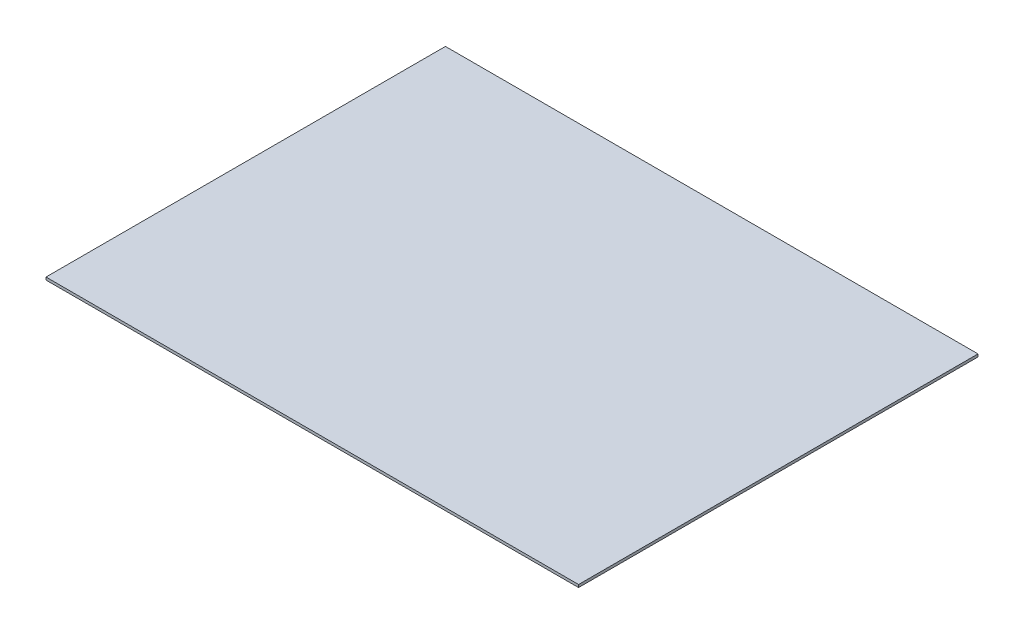
ISO-10303-21;
HEADER;
FILE_DESCRIPTION(('STEP AP214'),'2;1');
FILE_NAME('part.step','',(''),(''),'','','');
FILE_SCHEMA(('AUTOMOTIVE_DESIGN { 1 0 10303 214 1 1 1 1 }'));
ENDSEC;
DATA;
#1=APPLICATION_CONTEXT('core data for automotive mechanical design processes');
#2=APPLICATION_PROTOCOL_DEFINITION('international standard','automotive_design',2000,#1);
#3=PRODUCT_CONTEXT('',#1,'mechanical');
#4=PRODUCT('Part','Part','',(#3));
#5=PRODUCT_RELATED_PRODUCT_CATEGORY('part','',(#4));
#6=PRODUCT_DEFINITION_FORMATION('','',#4);
#7=PRODUCT_DEFINITION_CONTEXT('part definition',#1,'design');
#8=PRODUCT_DEFINITION('design','',#6,#7);
#9=PRODUCT_DEFINITION_SHAPE('','',#8);
#10=(LENGTH_UNIT() NAMED_UNIT(*) SI_UNIT(.MILLI.,.METRE.));
#11=(NAMED_UNIT(*) PLANE_ANGLE_UNIT() SI_UNIT($,.RADIAN.));
#12=(NAMED_UNIT(*) SI_UNIT($,.STERADIAN.) SOLID_ANGLE_UNIT());
#13=UNCERTAINTY_MEASURE_WITH_UNIT(LENGTH_MEASURE(1.E-05),#10,'distance_accuracy_value','');
#14=(GEOMETRIC_REPRESENTATION_CONTEXT(3) GLOBAL_UNCERTAINTY_ASSIGNED_CONTEXT((#13)) GLOBAL_UNIT_ASSIGNED_CONTEXT((#10,
#11,#12)) REPRESENTATION_CONTEXT('',''));
#15=CARTESIAN_POINT('',(0.,0.,0.));
#16=DIRECTION('',(0.,0.,1.));
#17=DIRECTION('',(1.,0.,0.));
#18=AXIS2_PLACEMENT_3D('',#15,#16,#17);
#19=CARTESIAN_POINT('',(400.,4.,300.));
#20=DIRECTION('',(-1.,0.,0.));
#21=DIRECTION('',(0.,0.,1.));
#22=AXIS2_PLACEMENT_3D('',#19,#20,#21);
#23=PLANE('',#22);
#24=DIRECTION('',(0.,0.,-1.));
#25=VECTOR('',#24,1.);
#26=CARTESIAN_POINT('',(400.,0.,300.));
#27=LINE('',#26,#25);
#28=CARTESIAN_POINT('',(400.,0.,300.));
#29=VERTEX_POINT('',#28);
#30=CARTESIAN_POINT('',(400.,0.,-300.));
#31=VERTEX_POINT('',#30);
#32=EDGE_CURVE('E80',#29,#31,#27,.T.);
#33=ORIENTED_EDGE('',*,*,#32,.T.);
#34=DIRECTION('',(0.,-1.,0.));
#35=VECTOR('',#34,1.);
#36=CARTESIAN_POINT('',(400.,4.,-300.));
#37=LINE('',#36,#35);
#38=CARTESIAN_POINT('',(400.,4.,-300.));
#39=VERTEX_POINT('',#38);
#40=EDGE_CURVE('E11',#39,#31,#37,.T.);
#41=ORIENTED_EDGE('',*,*,#40,.F.);
#42=DIRECTION('',(0.,0.,-1.));
#43=VECTOR('',#42,1.);
#44=CARTESIAN_POINT('',(400.,4.,300.));
#45=LINE('',#44,#43);
#46=CARTESIAN_POINT('',(400.,4.,300.));
#47=VERTEX_POINT('',#46);
#48=EDGE_CURVE('E68',#47,#39,#45,.T.);
#49=ORIENTED_EDGE('',*,*,#48,.F.);
#50=DIRECTION('',(0.,-1.,0.));
#51=VECTOR('',#50,1.);
#52=CARTESIAN_POINT('',(400.,4.,300.));
#53=LINE('',#52,#51);
#54=EDGE_CURVE('E76',#47,#29,#53,.T.);
#55=ORIENTED_EDGE('',*,*,#54,.T.);
#56=EDGE_LOOP('',(#33,#41,#49,#55));
#57=FACE_BOUND('',#56,.T.);
#58=ADVANCED_FACE('F17',(#57),#23,.F.);
#59=CARTESIAN_POINT('',(-400.,4.,-300.));
#60=DIRECTION('',(0.,0.,1.));
#61=DIRECTION('',(1.,0.,0.));
#62=AXIS2_PLACEMENT_3D('',#59,#60,#61);
#63=PLANE('',#62);
#64=DIRECTION('',(-1.,0.,0.));
#65=VECTOR('',#64,1.);
#66=CARTESIAN_POINT('',(-400.,0.,-300.));
#67=LINE('',#66,#65);
#68=CARTESIAN_POINT('',(-400.,0.,-300.));
#69=VERTEX_POINT('',#68);
#70=EDGE_CURVE('E72',#31,#69,#67,.T.);
#71=ORIENTED_EDGE('',*,*,#70,.T.);
#72=DIRECTION('',(0.,-1.,0.));
#73=VECTOR('',#72,1.);
#74=CARTESIAN_POINT('',(-400.,4.,-300.));
#75=LINE('',#74,#73);
#76=CARTESIAN_POINT('',(-400.,4.,-300.));
#77=VERTEX_POINT('',#76);
#78=EDGE_CURVE('E25',#77,#69,#75,.T.);
#79=ORIENTED_EDGE('',*,*,#78,.F.);
#80=DIRECTION('',(-1.,0.,0.));
#81=VECTOR('',#80,1.);
#82=CARTESIAN_POINT('',(-400.,4.,-300.));
#83=LINE('',#82,#81);
#84=EDGE_CURVE('E63',#39,#77,#83,.T.);
#85=ORIENTED_EDGE('',*,*,#84,.F.);
#86=ORIENTED_EDGE('',*,*,#40,.T.);
#87=EDGE_LOOP('',(#71,#79,#85,#86));
#88=FACE_BOUND('',#87,.T.);
#89=ADVANCED_FACE('F71',(#88),#63,.F.);
#90=CARTESIAN_POINT('',(-400.,4.,300.));
#91=DIRECTION('',(1.,0.,0.));
#92=DIRECTION('',(0.,0.,-1.));
#93=AXIS2_PLACEMENT_3D('',#90,#91,#92);
#94=PLANE('',#93);
#95=DIRECTION('',(0.,0.,1.));
#96=VECTOR('',#95,1.);
#97=CARTESIAN_POINT('',(-400.,0.,300.));
#98=LINE('',#97,#96);
#99=CARTESIAN_POINT('',(-400.,0.,300.));
#100=VERTEX_POINT('',#99);
#101=EDGE_CURVE('E50',#69,#100,#98,.T.);
#102=ORIENTED_EDGE('',*,*,#101,.T.);
#103=DIRECTION('',(0.,-1.,0.));
#104=VECTOR('',#103,1.);
#105=CARTESIAN_POINT('',(-400.,4.,300.));
#106=LINE('',#105,#104);
#107=CARTESIAN_POINT('',(-400.,4.,300.));
#108=VERTEX_POINT('',#107);
#109=EDGE_CURVE('E73',#108,#100,#106,.T.);
#110=ORIENTED_EDGE('',*,*,#109,.F.);
#111=DIRECTION('',(0.,0.,1.));
#112=VECTOR('',#111,1.);
#113=CARTESIAN_POINT('',(-400.,4.,300.));
#114=LINE('',#113,#112);
#115=EDGE_CURVE('E66',#77,#108,#114,.T.);
#116=ORIENTED_EDGE('',*,*,#115,.F.);
#117=ORIENTED_EDGE('',*,*,#78,.T.);
#118=EDGE_LOOP('',(#102,#110,#116,#117));
#119=FACE_BOUND('',#118,.T.);
#120=ADVANCED_FACE('F74',(#119),#94,.F.);
#121=CARTESIAN_POINT('',(-400.,4.,300.));
#122=DIRECTION('',(0.,0.,-1.));
#123=DIRECTION('',(-1.,0.,0.));
#124=AXIS2_PLACEMENT_3D('',#121,#122,#123);
#125=PLANE('',#124);
#126=DIRECTION('',(1.,0.,0.));
#127=VECTOR('',#126,1.);
#128=CARTESIAN_POINT('',(-400.,0.,300.));
#129=LINE('',#128,#127);
#130=EDGE_CURVE('E56',#100,#29,#129,.T.);
#131=ORIENTED_EDGE('',*,*,#130,.T.);
#132=ORIENTED_EDGE('',*,*,#54,.F.);
#133=DIRECTION('',(1.,0.,0.));
#134=VECTOR('',#133,1.);
#135=CARTESIAN_POINT('',(-400.,4.,300.));
#136=LINE('',#135,#134);
#137=EDGE_CURVE('E33',#108,#47,#136,.T.);
#138=ORIENTED_EDGE('',*,*,#137,.F.);
#139=ORIENTED_EDGE('',*,*,#109,.T.);
#140=EDGE_LOOP('',(#131,#132,#138,#139));
#141=FACE_BOUND('',#140,.T.);
#142=ADVANCED_FACE('F87',(#141),#125,.F.);
#143=CARTESIAN_POINT('',(0.,4.,0.));
#144=DIRECTION('',(0.,-1.,0.));
#145=DIRECTION('',(0.,0.,-1.));
#146=AXIS2_PLACEMENT_3D('',#143,#144,#145);
#147=PLANE('',#146);
#148=ORIENTED_EDGE('',*,*,#48,.T.);
#149=ORIENTED_EDGE('',*,*,#84,.T.);
#150=ORIENTED_EDGE('',*,*,#115,.T.);
#151=ORIENTED_EDGE('',*,*,#137,.T.);
#152=EDGE_LOOP('',(#148,#149,#150,#151));
#153=FACE_BOUND('',#152,.T.);
#154=ADVANCED_FACE('F64',(#153),#147,.F.);
#155=CARTESIAN_POINT('',(0.,0.,0.));
#156=DIRECTION('',(0.,-1.,0.));
#157=DIRECTION('',(0.,0.,-1.));
#158=AXIS2_PLACEMENT_3D('',#155,#156,#157);
#159=PLANE('',#158);
#160=ORIENTED_EDGE('',*,*,#32,.F.);
#161=ORIENTED_EDGE('',*,*,#130,.F.);
#162=ORIENTED_EDGE('',*,*,#101,.F.);
#163=ORIENTED_EDGE('',*,*,#70,.F.);
#164=EDGE_LOOP('',(#160,#161,#162,#163));
#165=FACE_BOUND('',#164,.T.);
#166=ADVANCED_FACE('F90',(#165),#159,.T.);
#167=CLOSED_SHELL('',(#58,#89,#120,#142,#154,#166));
#168=MANIFOLD_SOLID_BREP('B1',#167);
#169=ADVANCED_BREP_SHAPE_REPRESENTATION('',(#18,#168),#14);
#170=SHAPE_DEFINITION_REPRESENTATION(#9,#169);
ENDSEC;
END-ISO-10303-21;
